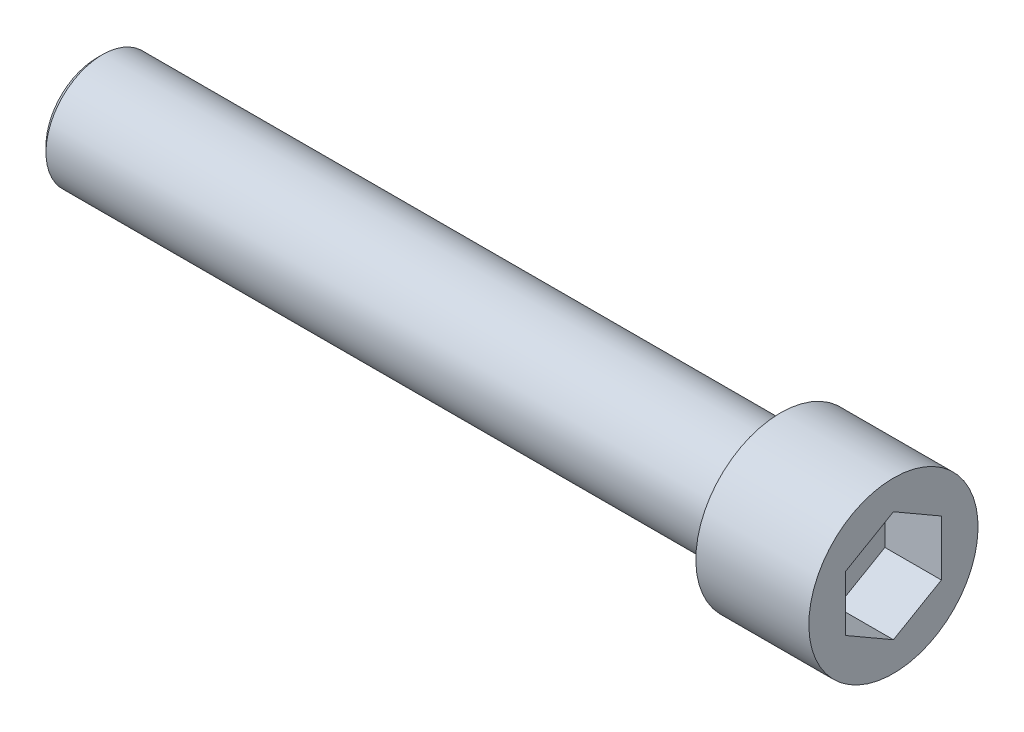
ISO-10303-21;
HEADER;
FILE_DESCRIPTION(('STEP AP214'),'2;1');
FILE_NAME('part.step','',(''),(''),'','','');
FILE_SCHEMA(('AUTOMOTIVE_DESIGN { 1 0 10303 214 1 1 1 1 }'));
ENDSEC;
DATA;
#1=APPLICATION_CONTEXT('core data for automotive mechanical design processes');
#2=APPLICATION_PROTOCOL_DEFINITION('international standard','automotive_design',2000,#1);
#3=PRODUCT_CONTEXT('',#1,'mechanical');
#4=PRODUCT('Part','Part','',(#3));
#5=PRODUCT_RELATED_PRODUCT_CATEGORY('part','',(#4));
#6=PRODUCT_DEFINITION_FORMATION('','',#4);
#7=PRODUCT_DEFINITION_CONTEXT('part definition',#1,'design');
#8=PRODUCT_DEFINITION('design','',#6,#7);
#9=PRODUCT_DEFINITION_SHAPE('','',#8);
#10=(LENGTH_UNIT() NAMED_UNIT(*) SI_UNIT(.MILLI.,.METRE.));
#11=(NAMED_UNIT(*) PLANE_ANGLE_UNIT() SI_UNIT($,.RADIAN.));
#12=(NAMED_UNIT(*) SI_UNIT($,.STERADIAN.) SOLID_ANGLE_UNIT());
#13=UNCERTAINTY_MEASURE_WITH_UNIT(LENGTH_MEASURE(1.E-05),#10,'distance_accuracy_value','');
#14=(GEOMETRIC_REPRESENTATION_CONTEXT(3) GLOBAL_UNCERTAINTY_ASSIGNED_CONTEXT((#13)) GLOBAL_UNIT_ASSIGNED_CONTEXT((#10,
#11,#12)) REPRESENTATION_CONTEXT('',''));
#15=CARTESIAN_POINT('',(0.,0.,0.));
#16=DIRECTION('',(0.,0.,1.));
#17=DIRECTION('',(1.,0.,0.));
#18=AXIS2_PLACEMENT_3D('',#15,#16,#17);
#19=CARTESIAN_POINT('',(-2985.10203153403,-2507.49624843147,-961.677863468537));
#20=DIRECTION('',(-0.99999961760378,-9.93743656935822E-11,0.00087452403872093));
#21=DIRECTION('',(-9.93744036939785E-11,1.,0.));
#22=AXIS2_PLACEMENT_3D('',#19,#20,#21);
#23=PLANE('',#22);
#24=CARTESIAN_POINT('',(-2985.10203149526,-2502.9962484317,-961.677818615072));
#25=DIRECTION('',(-0.99999961760378,-9.93743656935819E-11,0.00087452403872093));
#26=DIRECTION('',(-8.61739186081458E-09,-0.999999999950325,-9.9674366230049E-06));
#27=AXIS2_PLACEMENT_3D('',#24,#25,#26);
#28=CIRCLE('',#27,9.);
#29=CARTESIAN_POINT('',(-2985.10203141815,-2493.9962484317,-961.677728908142));
#30=VERTEX_POINT('',#29);
#31=EDGE_CURVE('E138',#30,#30,#28,.T.);
#32=ORIENTED_EDGE('',*,*,#31,.T.);
#33=EDGE_LOOP('',(#32));
#34=FACE_BOUND('',#33,.T.);
#35=ADVANCED_FACE('F17',(#34),#23,.T.);
#36=CARTESIAN_POINT('',(-2844.10087312942,-2493.1811842012,-961.800920091713));
#37=DIRECTION('',(0.000437269482219313,0.866020420021245,0.500008440830379));
#38=DIRECTION('',(0.99999961760393,0.,-0.000874523866603123));
#39=AXIS2_PLACEMENT_3D('',#36,#37,#38);
#40=PLANE('',#39);
#41=DIRECTION('',(0.000757355725019634,-0.500008632032037,0.86602008885808));
#42=VECTOR('',#41,1.);
#43=CARTESIAN_POINT('',(-2854.10086930545,-2493.18118420218,-961.792174851316));
#44=LINE('',#43,#42);
#45=CARTESIAN_POINT('',(-2854.10086930546,-2493.18118420219,-961.792174851326));
#46=VERTEX_POINT('',#45);
#47=CARTESIAN_POINT('',(-2854.09343589342,-2498.0887462133,-953.292227017085));
#48=VERTEX_POINT('',#47);
#49=EDGE_CURVE('E49',#46,#48,#44,.T.);
#50=ORIENTED_EDGE('',*,*,#49,.F.);
#51=DIRECTION('',(-0.99999961760378,-9.93743656935823E-11,0.00087452403872093));
#52=VECTOR('',#51,1.);
#53=CARTESIAN_POINT('',(-2844.10087312941,-2493.18118420119,-961.800920091703));
#54=LINE('',#53,#52);
#55=CARTESIAN_POINT('',(-2844.10087312942,-2493.1811842012,-961.800920091713));
#56=VERTEX_POINT('',#55);
#57=EDGE_CURVE('E154',#56,#46,#54,.T.);
#58=ORIENTED_EDGE('',*,*,#57,.F.);
#59=DIRECTION('',(-0.000757355725019634,0.500008632032037,-0.86602008885808));
#60=VECTOR('',#59,1.);
#61=CARTESIAN_POINT('',(-2844.09343971737,-2498.0887462123,-953.300972257462));
#62=LINE('',#61,#60);
#63=CARTESIAN_POINT('',(-2844.09343971738,-2498.08874621231,-953.300972257472));
#64=VERTEX_POINT('',#63);
#65=EDGE_CURVE('E11',#64,#56,#62,.T.);
#66=ORIENTED_EDGE('',*,*,#65,.F.);
#67=DIRECTION('',(-0.99999961760378,-9.93743656935823E-11,0.00087452403872093));
#68=VECTOR('',#67,1.);
#69=CARTESIAN_POINT('',(-2844.09343971737,-2498.0887462123,-953.300972257462));
#70=LINE('',#69,#68);
#71=EDGE_CURVE('E171',#64,#48,#70,.T.);
#72=ORIENTED_EDGE('',*,*,#71,.T.);
#73=EDGE_LOOP('',(#50,#58,#66,#72));
#74=FACE_BOUND('',#73,.T.);
#75=ADVANCED_FACE('F19',(#74),#40,.F.);
#76=CARTESIAN_POINT('',(-2844.09343980196,-2507.90370078804,-953.30107008741));
#77=DIRECTION('',(0.000437254556459166,-0.866030387461593,0.499991176723726));
#78=DIRECTION('',(-0.99999987254046,-0.000504895101901136,0.));
#79=AXIS2_PLACEMENT_3D('',#76,#77,#78);
#80=PLANE('',#79);
#81=DIRECTION('',(-0.000757364342411495,-0.499991367918934,-0.866030056294703));
#82=VECTOR('',#81,1.);
#83=CARTESIAN_POINT('',(-2854.09343597799,-2507.90370078905,-953.292324847013));
#84=LINE('',#83,#82);
#85=CARTESIAN_POINT('',(-2854.093435978,-2507.90370078904,-953.292324847023));
#86=VERTEX_POINT('',#85);
#87=CARTESIAN_POINT('',(-2854.10086947462,-2512.81109335366,-961.792370511202));
#88=VERTEX_POINT('',#87);
#89=EDGE_CURVE('E151',#86,#88,#84,.T.);
#90=ORIENTED_EDGE('',*,*,#89,.F.);
#91=DIRECTION('',(-0.99999961760378,-9.93743656935823E-11,0.00087452403872093));
#92=VECTOR('',#91,1.);
#93=CARTESIAN_POINT('',(-2844.09343980195,-2507.90370078805,-953.3010700874));
#94=LINE('',#93,#92);
#95=CARTESIAN_POINT('',(-2844.09343980196,-2507.90370078804,-953.30107008741));
#96=VERTEX_POINT('',#95);
#97=EDGE_CURVE('E164',#96,#86,#94,.T.);
#98=ORIENTED_EDGE('',*,*,#97,.F.);
#99=DIRECTION('',(0.000757364342411495,0.499991367918934,0.866030056294703));
#100=VECTOR('',#99,1.);
#101=CARTESIAN_POINT('',(-2844.10087329857,-2512.81109335268,-961.801115751599));
#102=LINE('',#101,#100);
#103=CARTESIAN_POINT('',(-2844.10087329858,-2512.81109335267,-961.801115751589));
#104=VERTEX_POINT('',#103);
#105=EDGE_CURVE('E29',#104,#96,#102,.T.);
#106=ORIENTED_EDGE('',*,*,#105,.F.);
#107=DIRECTION('',(-0.99999961760378,-9.93743656935823E-11,0.00087452403872093));
#108=VECTOR('',#107,1.);
#109=CARTESIAN_POINT('',(-2844.10087329857,-2512.81109335268,-961.801115751599));
#110=LINE('',#109,#108);
#111=EDGE_CURVE('E190',#104,#88,#110,.T.);
#112=ORIENTED_EDGE('',*,*,#111,.T.);
#113=EDGE_LOOP('',(#90,#98,#106,#112));
#114=FACE_BOUND('',#113,.T.);
#115=ADVANCED_FACE('F227',(#114),#80,.F.);
#116=CARTESIAN_POINT('',(-2844.10087327863,-2510.49613877656,-961.801092677426));
#117=DIRECTION('',(0.99999961760378,9.93743656935822E-11,-0.00087452403872093));
#118=DIRECTION('',(0.,-1.,-1.13632514709287E-07));
#119=AXIS2_PLACEMENT_3D('',#116,#117,#118);
#120=PLANE('',#119);
#121=DIRECTION('',(0.000757355725019634,-0.500008632032037,0.86602008885808));
#122=VECTOR('',#121,1.);
#123=CARTESIAN_POINT('',(-2844.10830671061,-2507.90353134157,-970.30106358584));
#124=LINE('',#123,#122);
#125=CARTESIAN_POINT('',(-2844.10830671062,-2507.90353134156,-970.30106358583));
#126=VERTEX_POINT('',#125);
#127=EDGE_CURVE('E194',#126,#104,#124,.T.);
#128=ORIENTED_EDGE('',*,*,#127,.T.);
#129=ORIENTED_EDGE('',*,*,#105,.T.);
#130=DIRECTION('',(8.61739186081458E-09,0.999999999950325,9.9674366230049E-06));
#131=VECTOR('',#130,1.);
#132=CARTESIAN_POINT('',(-2844.09343980195,-2507.90370078805,-953.3010700874));
#133=LINE('',#132,#131);
#134=EDGE_CURVE('E168',#96,#64,#133,.T.);
#135=ORIENTED_EDGE('',*,*,#134,.T.);
#136=ORIENTED_EDGE('',*,*,#65,.T.);
#137=DIRECTION('',(-0.000757364342411495,-0.499991367918933,-0.866030056294703));
#138=VECTOR('',#137,1.);
#139=CARTESIAN_POINT('',(-2844.10087312941,-2493.18118420119,-961.800920091703));
#140=LINE('',#139,#138);
#141=CARTESIAN_POINT('',(-2844.10830662604,-2498.08857676582,-970.300965755892));
#142=VERTEX_POINT('',#141);
#143=EDGE_CURVE('E157',#56,#142,#140,.T.);
#144=ORIENTED_EDGE('',*,*,#143,.T.);
#145=DIRECTION('',(-8.61739186081458E-09,-0.999999999950325,-9.9674366230049E-06));
#146=VECTOR('',#145,1.);
#147=CARTESIAN_POINT('',(-2844.10830662603,-2498.08857676581,-970.300965755902));
#148=LINE('',#147,#146);
#149=EDGE_CURVE('E179',#142,#126,#148,.T.);
#150=ORIENTED_EDGE('',*,*,#149,.T.);
#151=EDGE_LOOP('',(#128,#129,#135,#136,#144,#150));
#152=FACE_BOUND('',#151,.T.);
#153=CARTESIAN_POINT('',(-2844.10087321399,-2502.99613877692,-961.801017921651));
#154=DIRECTION('',(-0.99999961760378,-9.93743656935824E-11,0.00087452403872093));
#155=DIRECTION('',(-8.61739186081459E-09,-0.999999999950325,-9.9674366230049E-06));
#156=AXIS2_PLACEMENT_3D('',#153,#154,#155);
#157=CIRCLE('',#156,15.);
#158=CARTESIAN_POINT('',(-2844.10087308473,-2487.99613877768,-961.800868410102));
#159=VERTEX_POINT('',#158);
#160=EDGE_CURVE('E202',#159,#159,#157,.T.);
#161=ORIENTED_EDGE('',*,*,#160,.F.);
#162=EDGE_LOOP('',(#161));
#163=FACE_BOUND('',#162,.T.);
#164=ADVANCED_FACE('F241',(#152,#163),#120,.T.);
#165=CARTESIAN_POINT('',(-2854.10086939004,-2502.99613877793,-961.792272681264));
#166=DIRECTION('',(-0.99999961760378,-9.93743656935822E-11,0.00087452403872093));
#167=DIRECTION('',(-9.93744036939785E-11,1.,0.));
#168=AXIS2_PLACEMENT_3D('',#165,#166,#167);
#169=PLANE('',#168);
#170=DIRECTION('',(-0.000757355725019634,0.500008632032037,-0.86602008885808));
#171=VECTOR('',#170,1.);
#172=CARTESIAN_POINT('',(-2854.10086947461,-2512.81109335367,-961.792370511212));
#173=LINE('',#172,#171);
#174=CARTESIAN_POINT('',(-2854.10830288666,-2507.90353134255,-970.292318345443));
#175=VERTEX_POINT('',#174);
#176=EDGE_CURVE('E195',#88,#175,#173,.T.);
#177=ORIENTED_EDGE('',*,*,#176,.T.);
#178=DIRECTION('',(8.61739186081458E-09,0.999999999950325,9.9674366230049E-06));
#179=VECTOR('',#178,1.);
#180=CARTESIAN_POINT('',(-2854.10830288665,-2507.90353134256,-970.292318345453));
#181=LINE('',#180,#179);
#182=CARTESIAN_POINT('',(-2854.10830280208,-2498.08857676681,-970.292220515505));
#183=VERTEX_POINT('',#182);
#184=EDGE_CURVE('E182',#175,#183,#181,.T.);
#185=ORIENTED_EDGE('',*,*,#184,.T.);
#186=DIRECTION('',(0.000757364342411495,0.499991367918933,0.866030056294703));
#187=VECTOR('',#186,1.);
#188=CARTESIAN_POINT('',(-2854.10830280207,-2498.0885767668,-970.292220515515));
#189=LINE('',#188,#187);
#190=EDGE_CURVE('E160',#183,#46,#189,.T.);
#191=ORIENTED_EDGE('',*,*,#190,.T.);
#192=ORIENTED_EDGE('',*,*,#49,.T.);
#193=DIRECTION('',(-8.61739186081458E-09,-0.999999999950325,-9.9674366230049E-06));
#194=VECTOR('',#193,1.);
#195=CARTESIAN_POINT('',(-2854.09343589341,-2498.08874621329,-953.292227017075));
#196=LINE('',#195,#194);
#197=EDGE_CURVE('E174',#48,#86,#196,.T.);
#198=ORIENTED_EDGE('',*,*,#197,.T.);
#199=ORIENTED_EDGE('',*,*,#89,.T.);
#200=EDGE_LOOP('',(#177,#185,#191,#192,#198,#199));
#201=FACE_BOUND('',#200,.T.);
#202=ADVANCED_FACE('F221',(#201),#169,.F.);
#203=CARTESIAN_POINT('',(-2844.10830662604,-2498.08857676582,-970.300965755892));
#204=DIRECTION('',(-0.000437254556459166,0.866030387461593,-0.499991176723726));
#205=DIRECTION('',(-0.999999617603629,0.,0.000874524210846662));
#206=AXIS2_PLACEMENT_3D('',#203,#204,#205);
#207=PLANE('',#206);
#208=ORIENTED_EDGE('',*,*,#190,.F.);
#209=DIRECTION('',(-0.99999961760378,-9.93743656935823E-11,0.00087452403872093));
#210=VECTOR('',#209,1.);
#211=CARTESIAN_POINT('',(-2844.10830662603,-2498.08857676581,-970.300965755902));
#212=LINE('',#211,#210);
#213=EDGE_CURVE('E178',#142,#183,#212,.T.);
#214=ORIENTED_EDGE('',*,*,#213,.F.);
#215=ORIENTED_EDGE('',*,*,#143,.F.);
#216=ORIENTED_EDGE('',*,*,#57,.T.);
#217=EDGE_LOOP('',(#208,#214,#215,#216));
#218=FACE_BOUND('',#217,.T.);
#219=ADVANCED_FACE('F237',(#218),#207,.F.);
#220=CARTESIAN_POINT('',(-2844.09343971738,-2498.08874621231,-953.300972257472));
#221=DIRECTION('',(0.000874524038678479,-9.96744034761114E-06,0.999999617554105));
#222=DIRECTION('',(-0.0113968199418202,-0.999935054138624,0.));
#223=AXIS2_PLACEMENT_3D('',#220,#221,#222);
#224=PLANE('',#223);
#225=ORIENTED_EDGE('',*,*,#197,.F.);
#226=ORIENTED_EDGE('',*,*,#71,.F.);
#227=ORIENTED_EDGE('',*,*,#134,.F.);
#228=ORIENTED_EDGE('',*,*,#97,.T.);
#229=EDGE_LOOP('',(#225,#226,#227,#228));
#230=FACE_BOUND('',#229,.T.);
#231=ADVANCED_FACE('F244',(#230),#224,.F.);
#232=CARTESIAN_POINT('',(-2844.10830671062,-2507.90353134156,-970.30106358583));
#233=DIRECTION('',(-0.000874524038678479,9.96744034761114E-06,-0.999999617554105));
#234=DIRECTION('',(-0.99999961760378,0.,0.000874524038721921));
#235=AXIS2_PLACEMENT_3D('',#232,#233,#234);
#236=PLANE('',#235);
#237=ORIENTED_EDGE('',*,*,#184,.F.);
#238=DIRECTION('',(-0.99999961760378,-9.93743656935823E-11,0.00087452403872093));
#239=VECTOR('',#238,1.);
#240=CARTESIAN_POINT('',(-2844.10830671061,-2507.90353134157,-970.30106358584));
#241=LINE('',#240,#239);
#242=EDGE_CURVE('E186',#126,#175,#241,.T.);
#243=ORIENTED_EDGE('',*,*,#242,.F.);
#244=ORIENTED_EDGE('',*,*,#149,.F.);
#245=ORIENTED_EDGE('',*,*,#213,.T.);
#246=EDGE_LOOP('',(#237,#243,#244,#245));
#247=FACE_BOUND('',#246,.T.);
#248=ADVANCED_FACE('F234',(#247),#236,.F.);
#249=CARTESIAN_POINT('',(-2844.10087329858,-2512.81109335267,-961.801115751589));
#250=DIRECTION('',(-0.000437269482219313,-0.866020420021245,-0.500008440830379));
#251=DIRECTION('',(0.,0.500008488632343,-0.866020502814801));
#252=AXIS2_PLACEMENT_3D('',#249,#250,#251);
#253=PLANE('',#252);
#254=ORIENTED_EDGE('',*,*,#176,.F.);
#255=ORIENTED_EDGE('',*,*,#111,.F.);
#256=ORIENTED_EDGE('',*,*,#127,.F.);
#257=ORIENTED_EDGE('',*,*,#242,.T.);
#258=EDGE_LOOP('',(#254,#255,#256,#257));
#259=FACE_BOUND('',#258,.T.);
#260=ADVANCED_FACE('F230',(#259),#253,.F.);
#261=CARTESIAN_POINT('',(-2854.10086939004,-2502.99613877793,-961.792272681264));
#262=DIRECTION('',(0.99999961760378,9.93743656935824E-11,-0.00087452403872093));
#263=DIRECTION('',(-8.61739186081458E-09,-0.999999999950325,-9.9674366230049E-06));
#264=AXIS2_PLACEMENT_3D('',#261,#262,#263);
#265=CYLINDRICAL_SURFACE('',#264,15.);
#266=ORIENTED_EDGE('',*,*,#160,.T.);
#267=DIRECTION('',(-0.99999961760378,-9.93743656935822E-11,0.00087452403872093));
#268=VECTOR('',#267,1.);
#269=CARTESIAN_POINT('',(-2854.10086926078,-2487.99613877867,-961.792123169714));
#270=LINE('',#269,#268);
#271=CARTESIAN_POINT('',(-2864.1008654368,-2487.99613877966,-961.783377929327));
#272=VERTEX_POINT('',#271);
#273=EDGE_CURVE('E199',#159,#272,#270,.T.);
#274=ORIENTED_EDGE('',*,*,#273,.T.);
#275=CARTESIAN_POINT('',(-2864.10086556607,-2502.99613877891,-961.783527440877));
#276=DIRECTION('',(-0.99999961760378,-9.93743656935824E-11,0.00087452403872093));
#277=DIRECTION('',(-8.61739186081459E-09,-0.999999999950325,-9.9674366230049E-06));
#278=AXIS2_PLACEMENT_3D('',#275,#276,#277);
#279=CIRCLE('',#278,15.);
#280=EDGE_CURVE('E209',#272,#272,#279,.T.);
#281=ORIENTED_EDGE('',*,*,#280,.F.);
#282=ORIENTED_EDGE('',*,*,#273,.F.);
#283=EDGE_LOOP('',(#266,#274,#281,#282));
#284=FACE_BOUND('',#283,.T.);
#285=ADVANCED_FACE('F263',(#284),#265,.T.);
#286=CARTESIAN_POINT('',(-2864.10086567379,-2515.4961387783,-961.783652033834));
#287=DIRECTION('',(-0.99999961760378,-9.93743656935822E-11,0.00087452403872093));
#288=DIRECTION('',(-9.93744036939785E-11,1.,0.));
#289=AXIS2_PLACEMENT_3D('',#286,#287,#288);
#290=PLANE('',#289);
#291=CARTESIAN_POINT('',(-2864.10086557479,-2502.99614874626,-961.783537408412));
#292=DIRECTION('',(-0.99999961760378,-9.93743656935835E-11,0.00087452403872093));
#293=DIRECTION('',(-8.61739186081458E-09,-0.999999999950325,-9.9674366230049E-06));
#294=AXIS2_PLACEMENT_3D('',#291,#292,#293);
#295=CIRCLE('',#294,10.);
#296=CARTESIAN_POINT('',(-2864.10086548862,-2492.99614874676,-961.783437734046));
#297=VERTEX_POINT('',#296);
#298=EDGE_CURVE('E122',#297,#297,#295,.T.);
#299=ORIENTED_EDGE('',*,*,#298,.F.);
#300=EDGE_LOOP('',(#299));
#301=FACE_BOUND('',#300,.T.);
#302=ORIENTED_EDGE('',*,*,#280,.T.);
#303=EDGE_LOOP('',(#302));
#304=FACE_BOUND('',#303,.T.);
#305=ADVANCED_FACE('F266',(#301,#304),#290,.T.);
#306=CARTESIAN_POINT('',(-2882.10085869156,-2502.99614874805,-961.767795975716));
#307=DIRECTION('',(0.99999961760378,9.93743656935835E-11,-0.00087452403872093));
#308=DIRECTION('',(-8.61739186081458E-09,-0.999999999950325,-9.9674366230049E-06));
#309=AXIS2_PLACEMENT_3D('',#306,#307,#308);
#310=CYLINDRICAL_SURFACE('',#309,10.);
#311=DIRECTION('',(-0.99999961760378,-9.93743656935822E-11,0.000874524038720929));
#312=VECTOR('',#311,1.);
#313=CARTESIAN_POINT('',(-2882.10085860539,-2492.99614874855,-961.767696301349));
#314=LINE('',#313,#312);
#315=CARTESIAN_POINT('',(-2984.10193207261,-2492.99614875843,-961.678543696132));
#316=VERTEX_POINT('',#315);
#317=EDGE_CURVE('E114',#297,#316,#314,.T.);
#318=ORIENTED_EDGE('',*,*,#317,.F.);
#319=ORIENTED_EDGE('',*,*,#298,.T.);
#320=ORIENTED_EDGE('',*,*,#317,.T.);
#321=CARTESIAN_POINT('',(-2984.10213163778,-2512.9961487562,-961.678792725316));
#322=CARTESIAN_POINT('',(-2984.10198750755,-2512.99615489619,-961.515170130769));
#323=CARTESIAN_POINT('',(-2984.10184337753,-2512.99213833006,-961.351547766059));
#324=CARTESIAN_POINT('',(-2984.1015554619,-2512.97608470053,-961.024696874791));
#325=CARTESIAN_POINT('',(-2984.10141167629,-2512.96404763462,-960.861468348354));
#326=CARTESIAN_POINT('',(-2984.10112479357,-2512.93197791548,-960.535798563807));
#327=CARTESIAN_POINT('',(-2984.10098169645,-2512.91194525975,-960.373357305941));
#328=CARTESIAN_POINT('',(-2984.10069653289,-2512.86393371019,-960.049653338012));
#329=CARTESIAN_POINT('',(-2984.10055446644,-2512.83595481388,-959.888390628315));
#330=CARTESIAN_POINT('',(-2984.10027170397,-2512.77211788824,-959.567432265392));
#331=CARTESIAN_POINT('',(-2984.10013100795,-2512.73625985644,-959.407736612652));
#332=CARTESIAN_POINT('',(-2984.09985132279,-2512.65675111807,-959.090297079137));
#333=CARTESIAN_POINT('',(-2984.09971233365,-2512.61310040906,-958.932553198968));
#334=CARTESIAN_POINT('',(-2984.09943639457,-2512.51811144805,-958.61939722926));
#335=CARTESIAN_POINT('',(-2984.09929944463,-2512.46677319366,-958.463985140446));
#336=CARTESIAN_POINT('',(-2984.09902791139,-2512.35653282031,-958.155867153584));
#337=CARTESIAN_POINT('',(-2984.09889332809,-2512.297630699,-958.003161256379));
#338=CARTESIAN_POINT('',(-2984.09862684983,-2512.17240448505,-957.700823534043));
#339=CARTESIAN_POINT('',(-2984.09849495488,-2512.10608039011,-957.551191709871));
#340=CARTESIAN_POINT('',(-2984.09823416858,-2511.96617000423,-957.255362609383));
#341=CARTESIAN_POINT('',(-2984.09810527722,-2511.89258371102,-957.109165334137));
#342=CARTESIAN_POINT('',(-2984.09785080612,-2511.73832619869,-956.820557533457));
#343=CARTESIAN_POINT('',(-2984.09772522637,-2511.65765497735,-956.678147009201));
#344=CARTESIAN_POINT('',(-2984.09747767852,-2511.48942194716,-956.397455790112));
#345=CARTESIAN_POINT('',(-2984.09735571041,-2511.40186013617,-956.259175096563));
#346=CARTESIAN_POINT('',(-2984.09711567716,-2511.2200568651,-955.987076669653));
#347=CARTESIAN_POINT('',(-2984.09699761202,-2511.12581540295,-955.853258937681));
#348=CARTESIAN_POINT('',(-2984.09676566664,-2510.93087985991,-955.590408813296));
#349=CARTESIAN_POINT('',(-2984.0966517864,-2510.83018577702,-955.461376422375));
#350=CARTESIAN_POINT('',(-2984.09642848266,-2510.62258756779,-955.208407831435));
#351=CARTESIAN_POINT('',(-2984.09631905916,-2510.51568343952,-955.084471633004));
#352=CARTESIAN_POINT('',(-2984.09610493002,-2510.29592267547,-954.841994001485));
#353=CARTESIAN_POINT('',(-2984.09600022438,-2510.18306603783,-954.723452570078));
#354=CARTESIAN_POINT('',(-2984.0957957807,-2509.95167213111,-954.49205005085));
#355=CARTESIAN_POINT('',(-2984.09569604266,-2509.83313486026,-954.379188964798));
#356=CARTESIAN_POINT('',(-2984.09550177196,-2509.59066524845,-954.159419030338));
#357=CARTESIAN_POINT('',(-2984.0954072393,-2509.46673290581,-954.052510183784));
#358=CARTESIAN_POINT('',(-2984.0952236046,-2509.21377170902,-953.844902283172));
#359=CARTESIAN_POINT('',(-2984.09513450255,-2509.08474285329,-953.744203231048));
#360=CARTESIAN_POINT('',(-2984.09496194124,-2508.82189946699,-953.549257514464));
#361=CARTESIAN_POINT('',(-2984.09487848197,-2508.68808493494,-953.455010852014));
#362=CARTESIAN_POINT('',(-2984.09471740476,-2508.41599256189,-953.273196965824));
#363=CARTESIAN_POINT('',(-2984.09463978682,-2508.27771471951,-953.185629744165));
#364=CARTESIAN_POINT('',(-2984.09449057677,-2507.99702884436,-953.017385699489));
#365=CARTESIAN_POINT('',(-2984.09441898466,-2507.85462081031,-952.936708878619));
#366=CARTESIAN_POINT('',(-2984.09428199623,-2507.56601762048,-952.78243999611));
#367=CARTESIAN_POINT('',(-2984.09421659991,-2507.41982246353,-952.708847936678));
#368=CARTESIAN_POINT('',(-2984.09409215812,-2507.12399722026,-952.568925870055));
#369=CARTESIAN_POINT('',(-2984.09403311265,-2506.97436713287,-952.502595865125));
#370=CARTESIAN_POINT('',(-2984.0939215123,-2506.67203249628,-952.37735770581));
#371=CARTESIAN_POINT('',(-2984.09386895742,-2506.51932794613,-952.318449553737));
#372=CARTESIAN_POINT('',(-2984.09377046236,-2506.21121225839,-952.208197018757));
#373=CARTESIAN_POINT('',(-2984.09372452218,-2506.05580111997,-952.156852638208));
#374=CARTESIAN_POINT('',(-2984.0936393647,-2505.74264665069,-952.061851343316));
#375=CARTESIAN_POINT('',(-2984.0936001474,-2505.58490331911,-952.018194431368));
#376=CARTESIAN_POINT('',(-2984.09352852766,-2505.26746447714,-951.938673251129));
#377=CARTESIAN_POINT('',(-2984.09349612522,-2505.10776896615,-951.902808985265));
#378=CARTESIAN_POINT('',(-2984.09343821076,-2504.78681048218,-951.838959501659));
#379=CARTESIAN_POINT('',(-2984.09341269875,-2504.62554750872,-951.810974286371));
#380=CARTESIAN_POINT('',(-2984.0933686241,-2504.301842593,-951.762950327236));
#381=CARTESIAN_POINT('',(-2984.09335006146,-2504.13940065037,-951.742911585864));
#382=CARTESIAN_POINT('',(-2984.0933199278,-2503.81372912997,-951.71082885429));
#383=CARTESIAN_POINT('',(-2984.09330835678,-2503.65049955196,-951.698784866578));
#384=CARTESIAN_POINT('',(-2984.09329223171,-2503.32364599215,-951.682720662144));
#385=CARTESIAN_POINT('',(-2984.09328767767,-2503.16002201023,-951.678700447921));
#386=CARTESIAN_POINT('',(-2984.09328559505,-2502.83277382438,-951.678693480452));
#387=CARTESIAN_POINT('',(-2984.09328806647,-2502.66914962044,-951.682706729709));
#388=CARTESIAN_POINT('',(-2984.09330002632,-2502.34229517307,-951.698757025998));
#389=CARTESIAN_POINT('',(-2984.09330951475,-2502.17906492978,-951.710794075531));
#390=CARTESIAN_POINT('',(-2984.09333548325,-2501.8533916374,-951.742862979249));
#391=CARTESIAN_POINT('',(-2984.09335196334,-2501.69094858856,-951.762894835926));
#392=CARTESIAN_POINT('',(-2984.09339187295,-2501.36724102266,-951.810905100726));
#393=CARTESIAN_POINT('',(-2984.09341530249,-2501.20597650596,-951.838883511324));
#394=CARTESIAN_POINT('',(-2984.09346905208,-2500.88501450292,-951.902719486905));
#395=CARTESIAN_POINT('',(-2984.09349937213,-2500.72531701708,-951.938577054342));
#396=CARTESIAN_POINT('',(-2984.09356682721,-2500.40787379955,-952.018084965038));
#397=CARTESIAN_POINT('',(-2984.09360396223,-2500.25012806846,-952.061735310724));
#398=CARTESIAN_POINT('',(-2984.0936849553,-2499.93696838252,-952.156723625938));
#399=CARTESIAN_POINT('',(-2984.09372881334,-2499.78155442839,-952.208061597859));
#400=CARTESIAN_POINT('',(-2984.09382314429,-2499.47343270127,-952.318301493447));
#401=CARTESIAN_POINT('',(-2984.09387361719,-2499.32072492912,-952.377203419469));
#402=CARTESIAN_POINT('',(-2984.09398105377,-2499.01838345171,-952.502429328975));
#403=CARTESIAN_POINT('',(-2984.09403801745,-2498.86874974741,-952.56875331477));
#404=CARTESIAN_POINT('',(-2984.09415829584,-2498.57291688602,-952.70866356917));
#405=CARTESIAN_POINT('',(-2984.09422161057,-2498.42671773001,-952.782249840036));
#406=CARTESIAN_POINT('',(-2984.09435443602,-2498.13810617167,-952.936507394457));
#407=CARTESIAN_POINT('',(-2984.09442394676,-2497.99569377052,-953.017178680218));
#408=CARTESIAN_POINT('',(-2984.0945689943,-2497.71499880606,-953.185411925884));
#409=CARTESIAN_POINT('',(-2984.09464453111,-2497.57671624403,-953.272973887936));
#410=CARTESIAN_POINT('',(-2984.0948014463,-2497.30461409305,-953.454777547379));
#411=CARTESIAN_POINT('',(-2984.0948828247,-2497.1707945055,-953.549019246852));
#412=CARTESIAN_POINT('',(-2984.09505122454,-2496.90794068733,-953.743955350232));
#413=CARTESIAN_POINT('',(-2984.09513824598,-2496.77890645819,-953.844649756151));
#414=CARTESIAN_POINT('',(-2984.09531771978,-2496.52593421263,-954.05224869634));
#415=CARTESIAN_POINT('',(-2984.09541017213,-2496.40199619778,-954.159153232546));
#416=CARTESIAN_POINT('',(-2984.09560028253,-2496.15951495961,-954.378914896423));
#417=CARTESIAN_POINT('',(-2984.09569794057,-2496.04097173796,-954.491772025949));
#418=CARTESIAN_POINT('',(-2984.09589822458,-2495.80956566873,-954.723166999192));
#419=CARTESIAN_POINT('',(-2984.09600085054,-2495.69670282291,-954.841704844679));
#420=CARTESIAN_POINT('',(-2984.09621082066,-2495.47692940365,-955.084175687145));
#421=CARTESIAN_POINT('',(-2984.09631816482,-2495.37001883205,-955.208108685804));
#422=CARTESIAN_POINT('',(-2984.09653731023,-2495.16240752022,-955.461071274422));
#423=CARTESIAN_POINT('',(-2984.09664911148,-2495.06170678193,-955.590100865968));
#424=CARTESIAN_POINT('',(-2984.09687689924,-2494.86675773593,-955.852945801922));
#425=CARTESIAN_POINT('',(-2984.09699288575,-2494.77250943024,-955.986761147821));
#426=CARTESIAN_POINT('',(-2984.09722876211,-2494.59069230446,-956.258855224619));
#427=CARTESIAN_POINT('',(-2984.09734865196,-2494.50312348645,-956.397133956909));
#428=CARTESIAN_POINT('',(-2984.09759204368,-2494.3348762998,-956.677821685807));
#429=CARTESIAN_POINT('',(-2984.09771554554,-2494.2541979333,-956.820230683702));
#430=CARTESIAN_POINT('',(-2984.09796586127,-2494.09992601402,-957.108835872814));
#431=CARTESIAN_POINT('',(-2984.09809267513,-2494.02633246344,-957.255032065212));
#432=CARTESIAN_POINT('',(-2984.09834930684,-2493.88640747248,-957.550859448486));
#433=CARTESIAN_POINT('',(-2984.09847912469,-2493.82007603436,-957.700490640433));
#434=CARTESIAN_POINT('',(-2984.09874144914,-2493.69483507047,-958.002827552609));
#435=CARTESIAN_POINT('',(-2984.09887395574,-2493.63592554702,-958.155533273795));
#436=CARTESIAN_POINT('',(-2984.09914133597,-2493.52567033289,-958.463651367169));
#437=CARTESIAN_POINT('',(-2984.09927620961,-2493.47432464457,-958.619063740199));
#438=CARTESIAN_POINT('',(-2984.09954799648,-2493.37932080652,-958.932220739581));
#439=CARTESIAN_POINT('',(-2984.09968490973,-2493.33566265918,-959.08996536666));
#440=CARTESIAN_POINT('',(-2984.09996044349,-2493.2561390625,-959.407406856348));
#441=CARTESIAN_POINT('',(-2984.10009906402,-2493.22027361557,-959.567103719565));
#442=CARTESIAN_POINT('',(-2984.10037767589,-2493.15642190554,-959.888064965318));
#443=CARTESIAN_POINT('',(-2984.10051766725,-2493.1284356449,-960.049329348342));
#444=CARTESIAN_POINT('',(-2984.10079868103,-2493.08040944013,-960.373037122722));
#445=CARTESIAN_POINT('',(-2984.10093970346,-2493.06036949847,-960.535480514445));
#446=CARTESIAN_POINT('',(-2984.1012224372,-2493.02828530838,-960.861155022845));
#447=CARTESIAN_POINT('',(-2984.10136414851,-2493.01624106245,-961.024386139765));
#448=CARTESIAN_POINT('',(-2984.10164791594,-2493.00017320097,-961.351242662859));
#449=CARTESIAN_POINT('',(-2984.10178997207,-2492.99614958792,-961.514868069156));
#450=CARTESIAN_POINT('',(-2984.10193202854,-2492.99614875868,-961.678493876379));
#451=B_SPLINE_CURVE_WITH_KNOTS('',3,(#321,#322,#323,#324,#325,#326,#327,#328,#329,#330,#331,
#332,#333,#334,#335,#336,#337,#338,#339,#340,#341,#342,#343,#344,#345,#346,#347,#348,#349,#350,
#351,#352,#353,#354,#355,#356,#357,#358,#359,#360,#361,#362,#363,#364,#365,#366,#367,#368,#369,
#370,#371,#372,#373,#374,#375,#376,#377,#378,#379,#380,#381,#382,#383,#384,#385,#386,#387,#388,
#389,#390,#391,#392,#393,#394,#395,#396,#397,#398,#399,#400,#401,#402,#403,#404,#405,#406,#407,
#408,#409,#410,#411,#412,#413,#414,#415,#416,#417,#418,#419,#420,#421,#422,#423,#424,#425,#426,
#427,#428,#429,#430,#431,#432,#433,#434,#435,#436,#437,#438,#439,#440,#441,#442,#443,#444,#445,
#446,#447,#448,#449,#450),.UNSPECIFIED.,.F.,.F.,(4,2,2,2,2,2,2,2,2,2,2,2,2,2,2,2,2,2,2,2,2,2,2,
2,2,2,2,2,2,2,2,2,2,2,2,2,2,2,2,2,2,2,2,2,2,2,2,2,2,2,2,2,2,2,2,2,2,2,2,2,2,2,2,2,4),(0.,
0.490818197715875,0.981636548315373,1.47245505179839,1.96327370816482,2.45409251741483,
2.94491147954853,3.43573059456567,3.92654986246643,4.41736928325051,4.90818885691836,
5.39900858346975,5.88982846290444,6.38064849522277,6.87146868042489,7.36228901851037,
7.8531095094795,8.34393015333206,8.83475095006797,9.32557189968758,9.81639300219108,
10.3072142575776,10.7980356658481,11.2888572270018,11.7796789410393,12.27050080796,
12.7613228277647,13.2521450004526,13.742967326024,14.2337898044792,14.7246124358176,
15.2154352200401,15.7062581571455,16.1970812471352,16.6879044900077,17.178727885764,
17.6695514344039,18.1603751359275,18.6511989903342,19.1420229976251,19.632847157799,
20.1236714708564,20.6144959367976,21.1053205556224,21.5961453273306,22.0869702519225,
22.5777953293976,23.0686205597566,23.5594459429989,24.0502714791249,24.5410971681346,
25.0319230100275,25.5227490048041,26.013575152464,26.5044014530078,26.995227906435,
27.4860545127457,27.97688127194,28.4677081840179,28.9585352489792,29.4493624668241,
29.9401898375526,30.4310173611646,30.9218450376601,31.4126728670392),.UNSPECIFIED.);
#452=CARTESIAN_POINT('',(-2984.10213163778,-2512.9961487562,-961.678792725316));
#453=VERTEX_POINT('',#452);
#454=EDGE_CURVE('E118',#453,#316,#451,.T.);
#455=ORIENTED_EDGE('',*,*,#454,.F.);
#456=CARTESIAN_POINT('',(-2984.1019321167,-2492.99614875818,-961.678593550919));
#457=CARTESIAN_POINT('',(-2984.10207625019,-2492.99614469459,-961.842219875402));
#458=CARTESIAN_POINT('',(-2984.10222038343,-2493.00016344038,-962.005845919245));
#459=CARTESIAN_POINT('',(-2984.10250830529,-2493.01622162996,-962.332703953518));
#460=CARTESIAN_POINT('',(-2984.10265209392,-2493.02826107125,-962.495935944072));
#461=CARTESIAN_POINT('',(-2984.10293898249,-2493.0603357261,-962.821612431339));
#462=CARTESIAN_POINT('',(-2984.10308208244,-2493.08037093717,-962.984056928297));
#463=CARTESIAN_POINT('',(-2984.10336725146,-2493.1283877659,-963.307767139567));
#464=CARTESIAN_POINT('',(-2984.10350932053,-2493.15636938108,-963.469032854245));
#465=CARTESIAN_POINT('',(-2984.10379208803,-2493.22021189609,-963.789996984058));
#466=CARTESIAN_POINT('',(-2984.10393278645,-2493.25607279346,-963.949695399682));
#467=CARTESIAN_POINT('',(-2984.10421247622,-2493.33558739735,-964.267140208746));
#468=CARTESIAN_POINT('',(-2984.10435146756,-2493.37924110143,-964.424886602794));
#469=CARTESIAN_POINT('',(-2984.1046274108,-2493.47423616934,-964.738047344009));
#470=CARTESIAN_POINT('',(-2984.1047643627,-2493.52557753076,-964.893461691901));
#471=CARTESIAN_POINT('',(-2984.10503589966,-2493.63582421708,-965.201583935754));
#472=CARTESIAN_POINT('',(-2984.1051704847,-2493.69472953962,-965.354291832557));
#473=CARTESIAN_POINT('',(-2984.10543696622,-2493.81996223689,-965.656633289142));
#474=CARTESIAN_POINT('',(-2984.10556886268,-2493.8862896093,-965.806266849881));
#475=CARTESIAN_POINT('',(-2984.10582965178,-2494.02620661284,-966.102099155917));
#476=CARTESIAN_POINT('',(-2984.10595854441,-2494.09979624171,-966.248297902283));
#477=CARTESIAN_POINT('',(-2984.10621301784,-2494.25406046986,-966.53690837612));
#478=CARTESIAN_POINT('',(-2984.10633859864,-2494.33473506695,-966.679320104769));
#479=CARTESIAN_POINT('',(-2984.10658614836,-2494.50297487495,-966.960013463203));
#480=CARTESIAN_POINT('',(-2984.10670811728,-2494.59054008371,-967.098295094273));
#481=CARTESIAN_POINT('',(-2984.10694815192,-2494.7723501585,-967.370395127557));
#482=CARTESIAN_POINT('',(-2984.10706621764,-2494.86659502246,-967.50421353116));
#483=CARTESIAN_POINT('',(-2984.10729816396,-2495.06153735935,-967.767064732033));
#484=CARTESIAN_POINT('',(-2984.10741204455,-2495.16223483028,-967.896097530793));
#485=CARTESIAN_POINT('',(-2984.10763534876,-2495.36983978807,-968.149066673644));
#486=CARTESIAN_POINT('',(-2984.10774477238,-2495.47674727299,-968.273003019322));
#487=CARTESIAN_POINT('',(-2984.10795890154,-2495.69651470541,-968.51548068567));
#488=CARTESIAN_POINT('',(-2984.10806360708,-2495.80937465106,-968.63402200802));
#489=CARTESIAN_POINT('',(-2984.10826805034,-2496.04077511171,-968.86542405464));
#490=CARTESIAN_POINT('',(-2984.10836778806,-2496.15931562495,-968.978284780681));
#491=CARTESIAN_POINT('',(-2984.1085620579,-2496.40179164278,-969.198053746845));
#492=CARTESIAN_POINT('',(-2984.10865659003,-2496.52572714569,-969.304961988823));
#493=CARTESIAN_POINT('',(-2984.10884022345,-2496.77869456802,-969.512568439249));
#494=CARTESIAN_POINT('',(-2984.10892932476,-2496.90772648584,-969.613266649632));
#495=CARTESIAN_POINT('',(-2984.10910188439,-2497.17057588564,-969.808210449925));
#496=CARTESIAN_POINT('',(-2984.10918534271,-2497.30439336612,-969.902456041845));
#497=CARTESIAN_POINT('',(-2984.10934641785,-2497.5764915102,-970.084267563345));
#498=CARTESIAN_POINT('',(-2984.10942403465,-2497.71477217241,-970.171833495005));
#499=CARTESIAN_POINT('',(-2984.10957324225,-2497.99546354696,-970.340074746145));
#500=CARTESIAN_POINT('',(-2984.10964483304,-2498.13787425801,-970.42075006777));
#501=CARTESIAN_POINT('',(-2984.10978181866,-2498.42648264777,-970.575015749215));
#502=CARTESIAN_POINT('',(-2984.10984721349,-2498.57268032531,-970.648606111241));
#503=CARTESIAN_POINT('',(-2984.10997165213,-2498.86851044268,-970.78852459227));
#504=CARTESIAN_POINT('',(-2984.11003069595,-2499.01814288145,-970.854852713535));
#505=CARTESIAN_POINT('',(-2984.11014229285,-2499.32048204149,-970.98008692731));
#506=CARTESIAN_POINT('',(-2984.11019484592,-2499.47318876181,-971.038993022132));
#507=CARTESIAN_POINT('',(-2984.11029333723,-2499.78130859917,-971.1492412777));
#508=CARTESIAN_POINT('',(-2984.11033927546,-2499.93672171537,-971.200583440802));
#509=CARTESIAN_POINT('',(-2984.11042442892,-2500.24987993902,-971.295580149874));
#510=CARTESIAN_POINT('',(-2984.11046364414,-2500.40762504573,-971.339234698237));
#511=CARTESIAN_POINT('',(-2984.11053525962,-2500.72506722715,-971.418751014986));
#512=CARTESIAN_POINT('',(-2984.11056765987,-2500.88476430125,-971.4546127858));
#513=CARTESIAN_POINT('',(-2984.11062556985,-2501.20572569201,-971.518457158154));
#514=CARTESIAN_POINT('',(-2984.11065107958,-2501.36699000817,-971.54643976215));
#515=CARTESIAN_POINT('',(-2984.11069514956,-2501.6906973822,-971.594458393232));
#516=CARTESIAN_POINT('',(-2984.11071370982,-2501.8531404397,-971.614494422793));
#517=CARTESIAN_POINT('',(-2984.11074383865,-2502.17881395612,-971.646571641403));
#518=CARTESIAN_POINT('',(-2984.11075540722,-2502.3420444148,-971.658612832943));
#519=CARTESIAN_POINT('',(-2984.11077152732,-2502.66889949661,-971.674671372204));
#520=CARTESIAN_POINT('',(-2984.11077607885,-2502.83252411961,-971.678688722425));
#521=CARTESIAN_POINT('',(-2984.11077815641,-2503.15977334379,-971.678689905895));
#522=CARTESIAN_POINT('',(-2984.11077568243,-2503.32339794496,-971.674673741647));
#523=CARTESIAN_POINT('',(-2984.11076371744,-2503.65025293947,-971.658617576475));
#524=CARTESIAN_POINT('',(-2984.11075422643,-2503.81348333293,-971.64657757805));
#525=CARTESIAN_POINT('',(-2984.11072825273,-2504.13915667594,-971.61450275493));
#526=CARTESIAN_POINT('',(-2984.11071177005,-2504.30159962574,-971.594467932725));
#527=CARTESIAN_POINT('',(-2984.11067185523,-2504.62530674263,-971.546451732666));
#528=CARTESIAN_POINT('',(-2984.1106484231,-2504.78657091009,-971.518470357287));
#529=CARTESIAN_POINT('',(-2984.11059466833,-2505.10753196353,-971.454628465411));
#530=CARTESIAN_POINT('',(-2984.11056434569,-2505.26722885,-971.418767951369));
#531=CARTESIAN_POINT('',(-2984.11049688548,-2505.58467061865,-971.339254178193));
#532=CARTESIAN_POINT('',(-2984.1104597479,-2505.74241550144,-971.295600921487));
#533=CARTESIAN_POINT('',(-2984.11037874978,-2506.0555732427,-971.200606832353));
#534=CARTESIAN_POINT('',(-2984.11033488923,-2506.2109861019,-971.149266002321));
#535=CARTESIAN_POINT('',(-2984.11024055333,-2506.51910539425,-971.039020455879));
#536=CARTESIAN_POINT('',(-2984.11019007798,-2506.67181182825,-970.980115741826));
#537=CARTESIAN_POINT('',(-2984.11008263659,-2506.9741503887,-970.854884338668));
#538=CARTESIAN_POINT('',(-2984.11002567055,-2507.12378251611,-970.788557651875));
#539=CARTESIAN_POINT('',(-2984.1099053875,-2507.41961198841,-970.648642094658));
#540=CARTESIAN_POINT('',(-2984.1098420705,-2507.56580933437,-970.575053226495));
#541=CARTESIAN_POINT('',(-2984.10970924059,-2507.85441704368,-970.420790593089));
#542=CARTESIAN_POINT('',(-2984.10963972768,-2507.99682740822,-970.340116830052));
#543=CARTESIAN_POINT('',(-2984.10949467591,-2508.27751807802,-970.17187876147));
#544=CARTESIAN_POINT('',(-2984.10941913706,-2508.41579838456,-970.084314458072));
#545=CARTESIAN_POINT('',(-2984.10926221788,-2508.68789581158,-969.902506263133));
#546=CARTESIAN_POINT('',(-2984.10918083757,-2508.82171293344,-969.808262373674));
#547=CARTESIAN_POINT('',(-2984.10901243403,-2509.08456161669,-969.613322052559));
#548=CARTESIAN_POINT('',(-2984.10892541081,-2509.21359317957,-969.512625622912));
#549=CARTESIAN_POINT('',(-2984.10874593362,-2509.46655989952,-969.305022811957));
#550=CARTESIAN_POINT('',(-2984.10865347965,-2509.59049505817,-969.198116432584));
#551=CARTESIAN_POINT('',(-2984.10846336619,-2509.83297040217,-968.978351272874));
#552=CARTESIAN_POINT('',(-2984.1083657067,-2509.9515105892,-968.865492494392));
#553=CARTESIAN_POINT('',(-2984.10816541997,-2510.18291041964,-968.634094426853));
#554=CARTESIAN_POINT('',(-2984.10806279274,-2510.29577006481,-968.515555139566));
#555=CARTESIAN_POINT('',(-2984.10785282028,-2510.51553692629,-968.273081629481));
#556=CARTESIAN_POINT('',(-2984.10774547505,-2510.62244414445,-968.149147408363));
#557=CARTESIAN_POINT('',(-2984.10752632769,-2510.83004860677,-967.896182602368));
#558=CARTESIAN_POINT('',(-2984.10741452556,-2510.93074585286,-967.767152019079));
#559=CARTESIAN_POINT('',(-2984.10718673627,-2511.12568778641,-967.504305337891));
#560=CARTESIAN_POINT('',(-2984.10707074909,-2511.21993247588,-967.370489241483));
#561=CARTESIAN_POINT('',(-2984.10683487163,-2511.40174225652,-967.098393911734));
#562=CARTESIAN_POINT('',(-2984.10671498134,-2511.48930734976,-966.960114679783));
#563=CARTESIAN_POINT('',(-2984.10647158896,-2511.6575469901,-966.679426208509));
#564=CARTESIAN_POINT('',(-2984.10634808688,-2511.73822153936,-966.537016970471));
#565=CARTESIAN_POINT('',(-2984.10609777095,-2511.89248574395,-966.248411565922));
#566=CARTESIAN_POINT('',(-2984.10597095711,-2511.96607540149,-966.102215400589));
#567=CARTESIAN_POINT('',(-2984.10571432568,-2512.10599254324,-965.806388343177));
#568=CARTESIAN_POINT('',(-2984.10558450809,-2512.17232002972,-965.656757452168));
#569=CARTESIAN_POINT('',(-2984.10532218439,-2512.29755304473,-965.354421419445));
#570=CARTESIAN_POINT('',(-2984.1051896783,-2512.35645857558,-965.201716278688));
#571=CARTESIAN_POINT('',(-2984.10492229932,-2512.4667057769,-964.893599628517));
#572=CARTESIAN_POINT('',(-2984.10478742643,-2512.51804744973,-964.738188119945));
#573=CARTESIAN_POINT('',(-2984.10451564131,-2512.61304324748,-964.425033135485));
#574=CARTESIAN_POINT('',(-2984.10437872907,-2512.6566973748,-964.267289660324));
#575=CARTESIAN_POINT('',(-2984.10410319756,-2512.73621294077,-963.949850763021));
#576=CARTESIAN_POINT('',(-2984.10396457829,-2512.77207438184,-963.790155341486));
#577=CARTESIAN_POINT('',(-2984.10368596918,-2512.83591810826,-963.469197269046));
#578=CARTESIAN_POINT('',(-2984.10354597933,-2512.86390039606,-963.307934618628));
#579=CARTESIAN_POINT('',(-2984.10326496882,-2512.91191870222,-962.984230599656));
#580=CARTESIAN_POINT('',(-2984.10312394816,-2512.93195472306,-962.821789231468));
#581=CARTESIAN_POINT('',(-2984.10284121821,-2512.96403113761,-962.496119059397));
#582=CARTESIAN_POINT('',(-2984.10269950891,-2512.97607153381,-962.332890255758));
#583=CARTESIAN_POINT('',(-2984.10241574576,-2512.99213178097,-962.006038646448));
#584=CARTESIAN_POINT('',(-2984.10227369191,-2512.99615163442,-961.842415840899));
#585=CARTESIAN_POINT('',(-2984.10213163778,-2512.9961487562,-961.678792725316));
#586=B_SPLINE_CURVE_WITH_KNOTS('',3,(#456,#457,#458,#459,#460,#461,#462,#463,#464,#465,#466,
#467,#468,#469,#470,#471,#472,#473,#474,#475,#476,#477,#478,#479,#480,#481,#482,#483,#484,#485,
#486,#487,#488,#489,#490,#491,#492,#493,#494,#495,#496,#497,#498,#499,#500,#501,#502,#503,#504,
#505,#506,#507,#508,#509,#510,#511,#512,#513,#514,#515,#516,#517,#518,#519,#520,#521,#522,#523,
#524,#525,#526,#527,#528,#529,#530,#531,#532,#533,#534,#535,#536,#537,#538,#539,#540,#541,#542,
#543,#544,#545,#546,#547,#548,#549,#550,#551,#552,#553,#554,#555,#556,#557,#558,#559,#560,#561,
#562,#563,#564,#565,#566,#567,#568,#569,#570,#571,#572,#573,#574,#575,#576,#577,#578,#579,#580,
#581,#582,#583,#584,#585),.UNSPECIFIED.,.F.,.F.,(4,2,2,2,2,2,2,2,2,2,2,2,2,2,2,2,2,2,2,2,2,2,2,
2,2,2,2,2,2,2,2,2,2,2,2,2,2,2,2,2,2,2,2,2,2,2,2,2,2,2,2,2,2,2,2,2,2,2,2,2,2,2,2,2,4),(0.,
0.490829386276758,0.981658619670326,1.47248770018052,1.96331662780747,2.45414540255121,
2.94497402441176,3.4358024933889,3.92663080948277,4.41745897269349,4.90828698302076,
5.39911484046495,5.88994254502583,6.38077009670334,6.87159749549777,7.36242474140855,
7.85325183443632,8.34407877458088,8.83490556184209,9.32573219622013,9.816558677715,
10.3073850063264,10.7982111820544,11.2890372048994,11.7798630748612,12.2706887919394,
12.7615143561344,13.2523397674462,13.7431650258751,14.2339901314204,14.7248150840822,
15.2156398838609,15.7064645307564,16.1972890247685,16.6881133658975,17.1789375541434,
17.6697615895059,18.1605854719849,18.6514092015808,19.1422327782937,19.6330562021228,
20.1238794730691,20.6147025911319,21.1055255563115,21.5963483686075,22.0871710280207,
22.5779935345503,23.0688158881969,23.5596380889601,24.05046013684,24.5412820318368,
25.0321037739501,25.5229253631803,26.0137467995272,26.5045680829907,26.9953892135712,
27.4862101912682,27.977031016082,28.4678516880125,28.9586722070599,29.4494925732239,
29.9403127865045,30.4311328469021,30.9219527544162,31.4127725090472),.UNSPECIFIED.);
#587=EDGE_CURVE('E132',#316,#453,#586,.T.);
#588=ORIENTED_EDGE('',*,*,#587,.F.);
#589=EDGE_LOOP('',(#318,#319,#320,#455,#588));
#590=FACE_BOUND('',#589,.T.);
#591=ADVANCED_FACE('F116',(#590),#310,.T.);
#592=CARTESIAN_POINT('',(-2984.60203168645,-2502.99624843164,-961.678255877091));
#593=DIRECTION('',(0.99999961760378,9.93743656935827E-11,-0.00087452403872093));
#594=DIRECTION('',(-8.61739186081458E-09,-0.999999999950325,-9.9674366230049E-06));
#595=AXIS2_PLACEMENT_3D('',#592,#593,#594);
#596=CONICAL_SURFACE('',#595,9.5,0.7853981625);
#597=DIRECTION('',(-0.707106517519595,-0.707106780587099,0.000611333836624247));
#598=VECTOR('',#597,1.);
#599=CARTESIAN_POINT('',(-2984.60203160458,-2493.49624843212,-961.678161186443));
#600=LINE('',#599,#598);
#601=EDGE_CURVE('E131',#316,#30,#600,.T.);
#602=ORIENTED_EDGE('',*,*,#601,.T.);
#603=ORIENTED_EDGE('',*,*,#31,.F.);
#604=ORIENTED_EDGE('',*,*,#601,.F.);
#605=ORIENTED_EDGE('',*,*,#587,.T.);
#606=ORIENTED_EDGE('',*,*,#454,.T.);
#607=EDGE_LOOP('',(#602,#603,#604,#605,#606));
#608=FACE_BOUND('',#607,.T.);
#609=ADVANCED_FACE('F128',(#608),#596,.T.);
#610=CLOSED_SHELL('',(#35,#75,#115,#164,#202,#219,#231,#248,#260,#285,#305,#591,#609));
#611=MANIFOLD_SOLID_BREP('B1',#610);
#612=ADVANCED_BREP_SHAPE_REPRESENTATION('',(#18,#611),#14);
#613=SHAPE_DEFINITION_REPRESENTATION(#9,#612);
ENDSEC;
END-ISO-10303-21;
